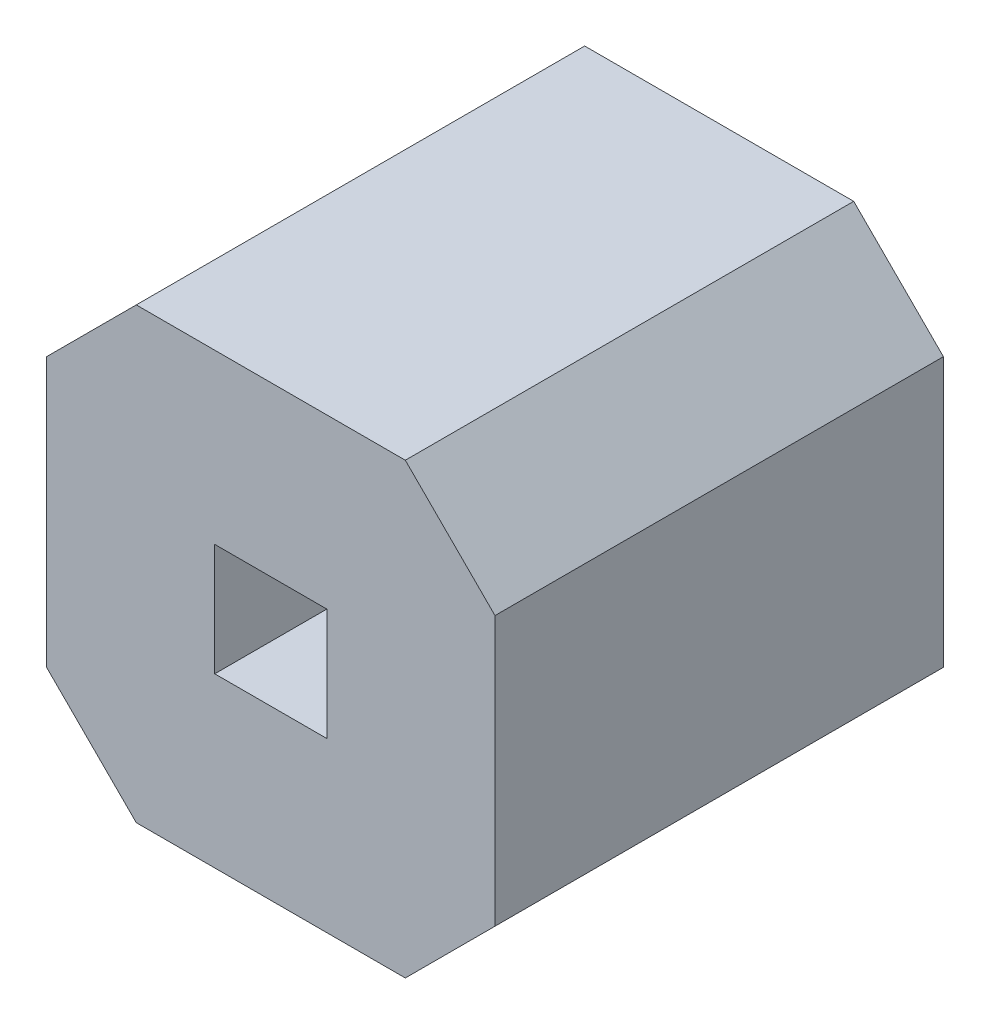
ISO-10303-21;
HEADER;
FILE_DESCRIPTION(('STEP AP214'),'2;1');
FILE_NAME('part.step','',(''),(''),'','','');
FILE_SCHEMA(('AUTOMOTIVE_DESIGN { 1 0 10303 214 1 1 1 1 }'));
ENDSEC;
DATA;
#1=APPLICATION_CONTEXT('core data for automotive mechanical design processes');
#2=APPLICATION_PROTOCOL_DEFINITION('international standard','automotive_design',2000,#1);
#3=PRODUCT_CONTEXT('',#1,'mechanical');
#4=PRODUCT('Part','Part','',(#3));
#5=PRODUCT_RELATED_PRODUCT_CATEGORY('part','',(#4));
#6=PRODUCT_DEFINITION_FORMATION('','',#4);
#7=PRODUCT_DEFINITION_CONTEXT('part definition',#1,'design');
#8=PRODUCT_DEFINITION('design','',#6,#7);
#9=PRODUCT_DEFINITION_SHAPE('','',#8);
#10=(LENGTH_UNIT() NAMED_UNIT(*) SI_UNIT(.MILLI.,.METRE.));
#11=(NAMED_UNIT(*) PLANE_ANGLE_UNIT() SI_UNIT($,.RADIAN.));
#12=(NAMED_UNIT(*) SI_UNIT($,.STERADIAN.) SOLID_ANGLE_UNIT());
#13=UNCERTAINTY_MEASURE_WITH_UNIT(LENGTH_MEASURE(1.E-05),#10,'distance_accuracy_value','');
#14=(GEOMETRIC_REPRESENTATION_CONTEXT(3) GLOBAL_UNCERTAINTY_ASSIGNED_CONTEXT((#13)) GLOBAL_UNIT_ASSIGNED_CONTEXT((#10,
#11,#12)) REPRESENTATION_CONTEXT('',''));
#15=CARTESIAN_POINT('',(0.,0.,0.));
#16=DIRECTION('',(0.,0.,1.));
#17=DIRECTION('',(1.,0.,0.));
#18=AXIS2_PLACEMENT_3D('',#15,#16,#17);
#19=CARTESIAN_POINT('',(0.,0.,2.54));
#20=DIRECTION('',(0.,0.,1.));
#21=DIRECTION('',(1.,0.,0.));
#22=AXIS2_PLACEMENT_3D('',#19,#20,#21);
#23=PLANE('',#22);
#24=DIRECTION('',(-1.,0.,0.));
#25=VECTOR('',#24,1.);
#26=CARTESIAN_POINT('',(0.508,2.54,2.54));
#27=LINE('',#26,#25);
#28=CARTESIAN_POINT('',(2.032,2.54,2.54));
#29=VERTEX_POINT('',#28);
#30=CARTESIAN_POINT('',(0.508,2.54,2.54));
#31=VERTEX_POINT('',#30);
#32=EDGE_CURVE('E158',#29,#31,#27,.T.);
#33=ORIENTED_EDGE('',*,*,#32,.T.);
#34=DIRECTION('',(-0.707106781186547,-0.707106781186548,0.));
#35=VECTOR('',#34,1.);
#36=CARTESIAN_POINT('',(0.,2.032,2.54));
#37=LINE('',#36,#35);
#38=CARTESIAN_POINT('',(0.,2.032,2.54));
#39=VERTEX_POINT('',#38);
#40=EDGE_CURVE('E161',#31,#39,#37,.T.);
#41=ORIENTED_EDGE('',*,*,#40,.T.);
#42=DIRECTION('',(0.,-1.,0.));
#43=VECTOR('',#42,1.);
#44=CARTESIAN_POINT('',(0.,0.508,2.54));
#45=LINE('',#44,#43);
#46=CARTESIAN_POINT('',(0.,0.508,2.54));
#47=VERTEX_POINT('',#46);
#48=EDGE_CURVE('E164',#39,#47,#45,.T.);
#49=ORIENTED_EDGE('',*,*,#48,.T.);
#50=DIRECTION('',(0.707106781186548,-0.707106781186548,0.));
#51=VECTOR('',#50,1.);
#52=CARTESIAN_POINT('',(0.,0.508,2.54));
#53=LINE('',#52,#51);
#54=CARTESIAN_POINT('',(0.508,0.,2.54));
#55=VERTEX_POINT('',#54);
#56=EDGE_CURVE('E166',#47,#55,#53,.T.);
#57=ORIENTED_EDGE('',*,*,#56,.T.);
#58=DIRECTION('',(1.,0.,0.));
#59=VECTOR('',#58,1.);
#60=CARTESIAN_POINT('',(0.508,0.,2.54));
#61=LINE('',#60,#59);
#62=CARTESIAN_POINT('',(2.032,0.,2.54));
#63=VERTEX_POINT('',#62);
#64=EDGE_CURVE('E168',#55,#63,#61,.T.);
#65=ORIENTED_EDGE('',*,*,#64,.T.);
#66=DIRECTION('',(0.707106781186548,0.707106781186547,0.));
#67=VECTOR('',#66,1.);
#68=CARTESIAN_POINT('',(2.032,0.,2.54));
#69=LINE('',#68,#67);
#70=CARTESIAN_POINT('',(2.54,0.508,2.54));
#71=VERTEX_POINT('',#70);
#72=EDGE_CURVE('E170',#63,#71,#69,.T.);
#73=ORIENTED_EDGE('',*,*,#72,.T.);
#74=DIRECTION('',(0.,1.,0.));
#75=VECTOR('',#74,1.);
#76=CARTESIAN_POINT('',(2.54,0.508,2.54));
#77=LINE('',#76,#75);
#78=CARTESIAN_POINT('',(2.54,2.032,2.54));
#79=VERTEX_POINT('',#78);
#80=EDGE_CURVE('E172',#71,#79,#77,.T.);
#81=ORIENTED_EDGE('',*,*,#80,.T.);
#82=DIRECTION('',(-0.707106781186548,0.707106781186548,0.));
#83=VECTOR('',#82,1.);
#84=CARTESIAN_POINT('',(2.032,2.54,2.54));
#85=LINE('',#84,#83);
#86=EDGE_CURVE('E174',#79,#29,#85,.T.);
#87=ORIENTED_EDGE('',*,*,#86,.T.);
#88=EDGE_LOOP('',(#33,#41,#49,#57,#65,#73,#81,#87));
#89=FACE_BOUND('',#88,.T.);
#90=DIRECTION('',(-1.,0.,0.));
#91=VECTOR('',#90,1.);
#92=CARTESIAN_POINT('',(0.9525,1.5875,2.54));
#93=LINE('',#92,#91);
#94=CARTESIAN_POINT('',(1.5875,1.5875,2.54));
#95=VERTEX_POINT('',#94);
#96=CARTESIAN_POINT('',(0.9525,1.5875,2.54));
#97=VERTEX_POINT('',#96);
#98=EDGE_CURVE('E130',#95,#97,#93,.T.);
#99=ORIENTED_EDGE('',*,*,#98,.F.);
#100=DIRECTION('',(0.,1.,0.));
#101=VECTOR('',#100,1.);
#102=CARTESIAN_POINT('',(1.5875,0.9525,2.54));
#103=LINE('',#102,#101);
#104=CARTESIAN_POINT('',(1.5875,0.9525,2.54));
#105=VERTEX_POINT('',#104);
#106=EDGE_CURVE('E122',#105,#95,#103,.T.);
#107=ORIENTED_EDGE('',*,*,#106,.F.);
#108=DIRECTION('',(1.,0.,0.));
#109=VECTOR('',#108,1.);
#110=CARTESIAN_POINT('',(0.9525,0.9525,2.54));
#111=LINE('',#110,#109);
#112=CARTESIAN_POINT('',(0.9525,0.9525,2.54));
#113=VERTEX_POINT('',#112);
#114=EDGE_CURVE('E144',#113,#105,#111,.T.);
#115=ORIENTED_EDGE('',*,*,#114,.F.);
#116=DIRECTION('',(0.,-1.,0.));
#117=VECTOR('',#116,1.);
#118=CARTESIAN_POINT('',(0.9525,0.9525,2.54));
#119=LINE('',#118,#117);
#120=EDGE_CURVE('E142',#97,#113,#119,.T.);
#121=ORIENTED_EDGE('',*,*,#120,.F.);
#122=EDGE_LOOP('',(#99,#107,#115,#121));
#123=FACE_BOUND('',#122,.T.);
#124=ADVANCED_FACE('F33',(#89,#123),#23,.T.);
#125=CARTESIAN_POINT('',(0.,0.,0.));
#126=DIRECTION('',(0.,0.,1.));
#127=DIRECTION('',(1.,0.,0.));
#128=AXIS2_PLACEMENT_3D('',#125,#126,#127);
#129=PLANE('',#128);
#130=DIRECTION('',(-1.,0.,0.));
#131=VECTOR('',#130,1.);
#132=CARTESIAN_POINT('',(0.508,2.54,0.));
#133=LINE('',#132,#131);
#134=CARTESIAN_POINT('',(2.032,2.54,0.));
#135=VERTEX_POINT('',#134);
#136=CARTESIAN_POINT('',(0.508,2.54,0.));
#137=VERTEX_POINT('',#136);
#138=EDGE_CURVE('E138',#135,#137,#133,.T.);
#139=ORIENTED_EDGE('',*,*,#138,.F.);
#140=DIRECTION('',(-0.707106781186548,0.707106781186548,0.));
#141=VECTOR('',#140,1.);
#142=CARTESIAN_POINT('',(2.032,2.54,0.));
#143=LINE('',#142,#141);
#144=CARTESIAN_POINT('',(2.54,2.032,0.));
#145=VERTEX_POINT('',#144);
#146=EDGE_CURVE('E162',#145,#135,#143,.T.);
#147=ORIENTED_EDGE('',*,*,#146,.F.);
#148=DIRECTION('',(0.,1.,0.));
#149=VECTOR('',#148,1.);
#150=CARTESIAN_POINT('',(2.54,0.508,0.));
#151=LINE('',#150,#149);
#152=CARTESIAN_POINT('',(2.54,0.508,0.));
#153=VERTEX_POINT('',#152);
#154=EDGE_CURVE('E189',#153,#145,#151,.T.);
#155=ORIENTED_EDGE('',*,*,#154,.F.);
#156=DIRECTION('',(0.707106781186548,0.707106781186547,0.));
#157=VECTOR('',#156,1.);
#158=CARTESIAN_POINT('',(2.032,0.,0.));
#159=LINE('',#158,#157);
#160=CARTESIAN_POINT('',(2.032,0.,0.));
#161=VERTEX_POINT('',#160);
#162=EDGE_CURVE('E187',#161,#153,#159,.T.);
#163=ORIENTED_EDGE('',*,*,#162,.F.);
#164=DIRECTION('',(1.,0.,0.));
#165=VECTOR('',#164,1.);
#166=CARTESIAN_POINT('',(0.508,0.,0.));
#167=LINE('',#166,#165);
#168=CARTESIAN_POINT('',(0.508,0.,0.));
#169=VERTEX_POINT('',#168);
#170=EDGE_CURVE('E185',#169,#161,#167,.T.);
#171=ORIENTED_EDGE('',*,*,#170,.F.);
#172=DIRECTION('',(0.707106781186548,-0.707106781186548,0.));
#173=VECTOR('',#172,1.);
#174=CARTESIAN_POINT('',(0.,0.508,0.));
#175=LINE('',#174,#173);
#176=CARTESIAN_POINT('',(0.,0.508,0.));
#177=VERTEX_POINT('',#176);
#178=EDGE_CURVE('E183',#177,#169,#175,.T.);
#179=ORIENTED_EDGE('',*,*,#178,.F.);
#180=DIRECTION('',(0.,-1.,0.));
#181=VECTOR('',#180,1.);
#182=CARTESIAN_POINT('',(0.,0.508,0.));
#183=LINE('',#182,#181);
#184=CARTESIAN_POINT('',(0.,2.032,0.));
#185=VERTEX_POINT('',#184);
#186=EDGE_CURVE('E181',#185,#177,#183,.T.);
#187=ORIENTED_EDGE('',*,*,#186,.F.);
#188=DIRECTION('',(-0.707106781186547,-0.707106781186548,0.));
#189=VECTOR('',#188,1.);
#190=CARTESIAN_POINT('',(0.,2.032,0.));
#191=LINE('',#190,#189);
#192=EDGE_CURVE('E179',#137,#185,#191,.T.);
#193=ORIENTED_EDGE('',*,*,#192,.F.);
#194=EDGE_LOOP('',(#139,#147,#155,#163,#171,#179,#187,#193));
#195=FACE_BOUND('',#194,.T.);
#196=DIRECTION('',(0.,1.,0.));
#197=VECTOR('',#196,1.);
#198=CARTESIAN_POINT('',(1.5875,0.9525,0.));
#199=LINE('',#198,#197);
#200=CARTESIAN_POINT('',(1.5875,0.9525,0.));
#201=VERTEX_POINT('',#200);
#202=CARTESIAN_POINT('',(1.5875,1.5875,0.));
#203=VERTEX_POINT('',#202);
#204=EDGE_CURVE('E56',#201,#203,#199,.T.);
#205=ORIENTED_EDGE('',*,*,#204,.T.);
#206=DIRECTION('',(-1.,0.,0.));
#207=VECTOR('',#206,1.);
#208=CARTESIAN_POINT('',(0.9525,1.5875,0.));
#209=LINE('',#208,#207);
#210=CARTESIAN_POINT('',(0.9525,1.5875,0.));
#211=VERTEX_POINT('',#210);
#212=EDGE_CURVE('E137',#203,#211,#209,.T.);
#213=ORIENTED_EDGE('',*,*,#212,.T.);
#214=DIRECTION('',(0.,-1.,0.));
#215=VECTOR('',#214,1.);
#216=CARTESIAN_POINT('',(0.9525,0.9525,0.));
#217=LINE('',#216,#215);
#218=CARTESIAN_POINT('',(0.9525,0.9525,0.));
#219=VERTEX_POINT('',#218);
#220=EDGE_CURVE('E150',#211,#219,#217,.T.);
#221=ORIENTED_EDGE('',*,*,#220,.T.);
#222=DIRECTION('',(1.,0.,0.));
#223=VECTOR('',#222,1.);
#224=CARTESIAN_POINT('',(0.9525,0.9525,0.));
#225=LINE('',#224,#223);
#226=EDGE_CURVE('E131',#219,#201,#225,.T.);
#227=ORIENTED_EDGE('',*,*,#226,.T.);
#228=EDGE_LOOP('',(#205,#213,#221,#227));
#229=FACE_BOUND('',#228,.T.);
#230=ADVANCED_FACE('F219',(#195,#229),#129,.F.);
#231=CARTESIAN_POINT('',(0.508,2.54,2.54));
#232=DIRECTION('',(0.,-1.,0.));
#233=DIRECTION('',(0.,0.,-1.));
#234=AXIS2_PLACEMENT_3D('',#231,#232,#233);
#235=PLANE('',#234);
#236=ORIENTED_EDGE('',*,*,#138,.T.);
#237=DIRECTION('',(0.,0.,-1.));
#238=VECTOR('',#237,1.);
#239=CARTESIAN_POINT('',(0.508,2.54,2.54));
#240=LINE('',#239,#238);
#241=EDGE_CURVE('E11',#31,#137,#240,.T.);
#242=ORIENTED_EDGE('',*,*,#241,.F.);
#243=ORIENTED_EDGE('',*,*,#32,.F.);
#244=DIRECTION('',(0.,0.,-1.));
#245=VECTOR('',#244,1.);
#246=CARTESIAN_POINT('',(2.032,2.54,2.54));
#247=LINE('',#246,#245);
#248=EDGE_CURVE('E176',#29,#135,#247,.T.);
#249=ORIENTED_EDGE('',*,*,#248,.T.);
#250=EDGE_LOOP('',(#236,#242,#243,#249));
#251=FACE_BOUND('',#250,.T.);
#252=ADVANCED_FACE('F35',(#251),#235,.F.);
#253=CARTESIAN_POINT('',(0.,2.032,2.54));
#254=DIRECTION('',(0.707106781186548,-0.707106781186547,0.));
#255=DIRECTION('',(0.707106781186547,0.707106781186548,0.));
#256=AXIS2_PLACEMENT_3D('',#253,#254,#255);
#257=PLANE('',#256);
#258=ORIENTED_EDGE('',*,*,#192,.T.);
#259=DIRECTION('',(0.,0.,-1.));
#260=VECTOR('',#259,1.);
#261=CARTESIAN_POINT('',(0.,2.032,2.54));
#262=LINE('',#261,#260);
#263=EDGE_CURVE('E41',#39,#185,#262,.T.);
#264=ORIENTED_EDGE('',*,*,#263,.F.);
#265=ORIENTED_EDGE('',*,*,#40,.F.);
#266=ORIENTED_EDGE('',*,*,#241,.T.);
#267=EDGE_LOOP('',(#258,#264,#265,#266));
#268=FACE_BOUND('',#267,.T.);
#269=ADVANCED_FACE('F236',(#268),#257,.F.);
#270=CARTESIAN_POINT('',(0.,0.508,2.54));
#271=DIRECTION('',(1.,0.,0.));
#272=DIRECTION('',(0.,0.,-1.));
#273=AXIS2_PLACEMENT_3D('',#270,#271,#272);
#274=PLANE('',#273);
#275=ORIENTED_EDGE('',*,*,#186,.T.);
#276=DIRECTION('',(0.,0.,-1.));
#277=VECTOR('',#276,1.);
#278=CARTESIAN_POINT('',(0.,0.508,2.54));
#279=LINE('',#278,#277);
#280=EDGE_CURVE('E206',#47,#177,#279,.T.);
#281=ORIENTED_EDGE('',*,*,#280,.F.);
#282=ORIENTED_EDGE('',*,*,#48,.F.);
#283=ORIENTED_EDGE('',*,*,#263,.T.);
#284=EDGE_LOOP('',(#275,#281,#282,#283));
#285=FACE_BOUND('',#284,.T.);
#286=ADVANCED_FACE('F213',(#285),#274,.F.);
#287=CARTESIAN_POINT('',(0.,0.508,2.54));
#288=DIRECTION('',(0.707106781186548,0.707106781186548,0.));
#289=DIRECTION('',(-0.707106781186548,0.707106781186548,0.));
#290=AXIS2_PLACEMENT_3D('',#287,#288,#289);
#291=PLANE('',#290);
#292=ORIENTED_EDGE('',*,*,#178,.T.);
#293=DIRECTION('',(0.,0.,-1.));
#294=VECTOR('',#293,1.);
#295=CARTESIAN_POINT('',(0.508,0.,2.54));
#296=LINE('',#295,#294);
#297=EDGE_CURVE('E203',#55,#169,#296,.T.);
#298=ORIENTED_EDGE('',*,*,#297,.F.);
#299=ORIENTED_EDGE('',*,*,#56,.F.);
#300=ORIENTED_EDGE('',*,*,#280,.T.);
#301=EDGE_LOOP('',(#292,#298,#299,#300));
#302=FACE_BOUND('',#301,.T.);
#303=ADVANCED_FACE('F225',(#302),#291,.F.);
#304=CARTESIAN_POINT('',(0.508,0.,2.54));
#305=DIRECTION('',(0.,1.,0.));
#306=DIRECTION('',(0.,0.,1.));
#307=AXIS2_PLACEMENT_3D('',#304,#305,#306);
#308=PLANE('',#307);
#309=ORIENTED_EDGE('',*,*,#170,.T.);
#310=DIRECTION('',(0.,0.,-1.));
#311=VECTOR('',#310,1.);
#312=CARTESIAN_POINT('',(2.032,0.,2.54));
#313=LINE('',#312,#311);
#314=EDGE_CURVE('E200',#63,#161,#313,.T.);
#315=ORIENTED_EDGE('',*,*,#314,.F.);
#316=ORIENTED_EDGE('',*,*,#64,.F.);
#317=ORIENTED_EDGE('',*,*,#297,.T.);
#318=EDGE_LOOP('',(#309,#315,#316,#317));
#319=FACE_BOUND('',#318,.T.);
#320=ADVANCED_FACE('F229',(#319),#308,.F.);
#321=CARTESIAN_POINT('',(2.032,0.,2.54));
#322=DIRECTION('',(-0.707106781186547,0.707106781186548,0.));
#323=DIRECTION('',(-0.707106781186548,-0.707106781186547,0.));
#324=AXIS2_PLACEMENT_3D('',#321,#322,#323);
#325=PLANE('',#324);
#326=ORIENTED_EDGE('',*,*,#162,.T.);
#327=DIRECTION('',(0.,0.,-1.));
#328=VECTOR('',#327,1.);
#329=CARTESIAN_POINT('',(2.54,0.508,2.54));
#330=LINE('',#329,#328);
#331=EDGE_CURVE('E197',#71,#153,#330,.T.);
#332=ORIENTED_EDGE('',*,*,#331,.F.);
#333=ORIENTED_EDGE('',*,*,#72,.F.);
#334=ORIENTED_EDGE('',*,*,#314,.T.);
#335=EDGE_LOOP('',(#326,#332,#333,#334));
#336=FACE_BOUND('',#335,.T.);
#337=ADVANCED_FACE('F249',(#336),#325,.F.);
#338=CARTESIAN_POINT('',(2.54,0.508,2.54));
#339=DIRECTION('',(-1.,0.,0.));
#340=DIRECTION('',(0.,0.,1.));
#341=AXIS2_PLACEMENT_3D('',#338,#339,#340);
#342=PLANE('',#341);
#343=ORIENTED_EDGE('',*,*,#154,.T.);
#344=DIRECTION('',(0.,0.,-1.));
#345=VECTOR('',#344,1.);
#346=CARTESIAN_POINT('',(2.54,2.032,2.54));
#347=LINE('',#346,#345);
#348=EDGE_CURVE('E194',#79,#145,#347,.T.);
#349=ORIENTED_EDGE('',*,*,#348,.F.);
#350=ORIENTED_EDGE('',*,*,#80,.F.);
#351=ORIENTED_EDGE('',*,*,#331,.T.);
#352=EDGE_LOOP('',(#343,#349,#350,#351));
#353=FACE_BOUND('',#352,.T.);
#354=ADVANCED_FACE('F247',(#353),#342,.F.);
#355=CARTESIAN_POINT('',(2.032,2.54,2.54));
#356=DIRECTION('',(-0.707106781186548,-0.707106781186548,0.));
#357=DIRECTION('',(0.707106781186548,-0.707106781186548,0.));
#358=AXIS2_PLACEMENT_3D('',#355,#356,#357);
#359=PLANE('',#358);
#360=ORIENTED_EDGE('',*,*,#146,.T.);
#361=ORIENTED_EDGE('',*,*,#248,.F.);
#362=ORIENTED_EDGE('',*,*,#86,.F.);
#363=ORIENTED_EDGE('',*,*,#348,.T.);
#364=EDGE_LOOP('',(#360,#361,#362,#363));
#365=FACE_BOUND('',#364,.T.);
#366=ADVANCED_FACE('F242',(#365),#359,.F.);
#367=CARTESIAN_POINT('',(1.5875,0.9525,2.54));
#368=DIRECTION('',(-1.,0.,0.));
#369=DIRECTION('',(0.,0.,1.));
#370=AXIS2_PLACEMENT_3D('',#367,#368,#369);
#371=PLANE('',#370);
#372=ORIENTED_EDGE('',*,*,#204,.F.);
#373=DIRECTION('',(0.,0.,-1.));
#374=VECTOR('',#373,1.);
#375=CARTESIAN_POINT('',(1.5875,0.9525,2.54));
#376=LINE('',#375,#374);
#377=EDGE_CURVE('E126',#105,#201,#376,.T.);
#378=ORIENTED_EDGE('',*,*,#377,.F.);
#379=ORIENTED_EDGE('',*,*,#106,.T.);
#380=DIRECTION('',(0.,0.,-1.));
#381=VECTOR('',#380,1.);
#382=CARTESIAN_POINT('',(1.5875,1.5875,2.54));
#383=LINE('',#382,#381);
#384=EDGE_CURVE('E125',#95,#203,#383,.T.);
#385=ORIENTED_EDGE('',*,*,#384,.T.);
#386=EDGE_LOOP('',(#372,#378,#379,#385));
#387=FACE_BOUND('',#386,.T.);
#388=ADVANCED_FACE('F124',(#387),#371,.T.);
#389=CARTESIAN_POINT('',(0.9525,1.5875,2.54));
#390=DIRECTION('',(0.,-1.,0.));
#391=DIRECTION('',(0.,0.,-1.));
#392=AXIS2_PLACEMENT_3D('',#389,#390,#391);
#393=PLANE('',#392);
#394=ORIENTED_EDGE('',*,*,#212,.F.);
#395=ORIENTED_EDGE('',*,*,#384,.F.);
#396=ORIENTED_EDGE('',*,*,#98,.T.);
#397=DIRECTION('',(0.,0.,-1.));
#398=VECTOR('',#397,1.);
#399=CARTESIAN_POINT('',(0.9525,1.5875,2.54));
#400=LINE('',#399,#398);
#401=EDGE_CURVE('E139',#97,#211,#400,.T.);
#402=ORIENTED_EDGE('',*,*,#401,.T.);
#403=EDGE_LOOP('',(#394,#395,#396,#402));
#404=FACE_BOUND('',#403,.T.);
#405=ADVANCED_FACE('F134',(#404),#393,.T.);
#406=CARTESIAN_POINT('',(0.9525,0.9525,2.54));
#407=DIRECTION('',(1.,0.,0.));
#408=DIRECTION('',(0.,0.,-1.));
#409=AXIS2_PLACEMENT_3D('',#406,#407,#408);
#410=PLANE('',#409);
#411=ORIENTED_EDGE('',*,*,#220,.F.);
#412=ORIENTED_EDGE('',*,*,#401,.F.);
#413=ORIENTED_EDGE('',*,*,#120,.T.);
#414=DIRECTION('',(0.,0.,-1.));
#415=VECTOR('',#414,1.);
#416=CARTESIAN_POINT('',(0.9525,0.9525,2.54));
#417=LINE('',#416,#415);
#418=EDGE_CURVE('E48',#113,#219,#417,.T.);
#419=ORIENTED_EDGE('',*,*,#418,.T.);
#420=EDGE_LOOP('',(#411,#412,#413,#419));
#421=FACE_BOUND('',#420,.T.);
#422=ADVANCED_FACE('F274',(#421),#410,.T.);
#423=CARTESIAN_POINT('',(0.9525,0.9525,2.54));
#424=DIRECTION('',(0.,1.,0.));
#425=DIRECTION('',(0.,0.,1.));
#426=AXIS2_PLACEMENT_3D('',#423,#424,#425);
#427=PLANE('',#426);
#428=ORIENTED_EDGE('',*,*,#226,.F.);
#429=ORIENTED_EDGE('',*,*,#418,.F.);
#430=ORIENTED_EDGE('',*,*,#114,.T.);
#431=ORIENTED_EDGE('',*,*,#377,.T.);
#432=EDGE_LOOP('',(#428,#429,#430,#431));
#433=FACE_BOUND('',#432,.T.);
#434=ADVANCED_FACE('F278',(#433),#427,.T.);
#435=CLOSED_SHELL('',(#124,#230,#252,#269,#286,#303,#320,#337,#354,#366,#388,#405,#422,#434));
#436=MANIFOLD_SOLID_BREP('B2',#435);
#437=ADVANCED_BREP_SHAPE_REPRESENTATION('',(#18,#436),#14);
#438=SHAPE_DEFINITION_REPRESENTATION(#9,#437);
ENDSEC;
END-ISO-10303-21;
